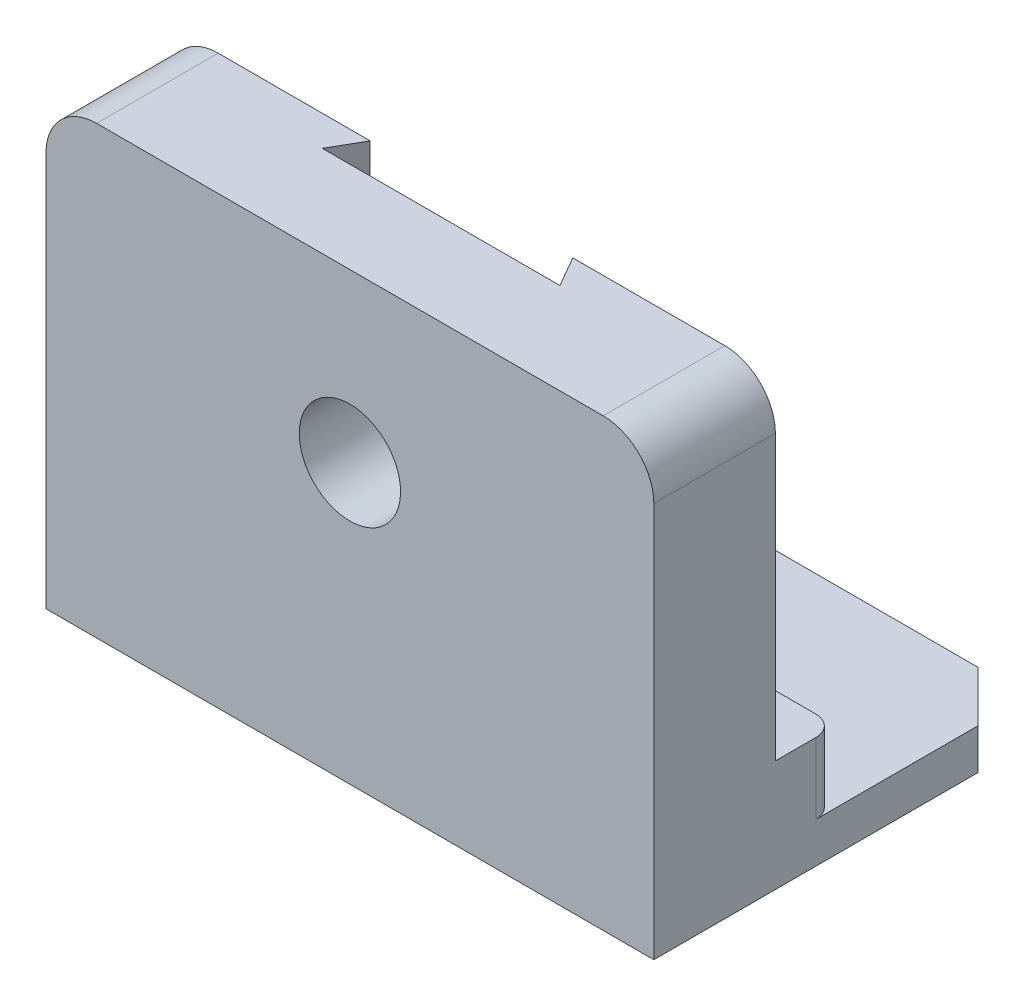
ISO-10303-21;
HEADER;
FILE_DESCRIPTION(('STEP AP214'),'2;1');
FILE_NAME('part.step','',(''),(''),'','','');
FILE_SCHEMA(('AUTOMOTIVE_DESIGN { 1 0 10303 214 1 1 1 1 }'));
ENDSEC;
DATA;
#1=APPLICATION_CONTEXT('core data for automotive mechanical design processes');
#2=APPLICATION_PROTOCOL_DEFINITION('international standard','automotive_design',2000,#1);
#3=PRODUCT_CONTEXT('',#1,'mechanical');
#4=PRODUCT('Part','Part','',(#3));
#5=PRODUCT_RELATED_PRODUCT_CATEGORY('part','',(#4));
#6=PRODUCT_DEFINITION_FORMATION('','',#4);
#7=PRODUCT_DEFINITION_CONTEXT('part definition',#1,'design');
#8=PRODUCT_DEFINITION('design','',#6,#7);
#9=PRODUCT_DEFINITION_SHAPE('','',#8);
#10=(LENGTH_UNIT() NAMED_UNIT(*) SI_UNIT(.MILLI.,.METRE.));
#11=(NAMED_UNIT(*) PLANE_ANGLE_UNIT() SI_UNIT($,.RADIAN.));
#12=(NAMED_UNIT(*) SI_UNIT($,.STERADIAN.) SOLID_ANGLE_UNIT());
#13=UNCERTAINTY_MEASURE_WITH_UNIT(LENGTH_MEASURE(1.E-05),#10,'distance_accuracy_value','');
#14=(GEOMETRIC_REPRESENTATION_CONTEXT(3) GLOBAL_UNCERTAINTY_ASSIGNED_CONTEXT((#13)) GLOBAL_UNIT_ASSIGNED_CONTEXT((#10,
#11,#12)) REPRESENTATION_CONTEXT('',''));
#15=CARTESIAN_POINT('',(0.,0.,0.));
#16=DIRECTION('',(0.,0.,1.));
#17=DIRECTION('',(1.,0.,0.));
#18=AXIS2_PLACEMENT_3D('',#15,#16,#17);
#19=CARTESIAN_POINT('',(30.,11.,-12.));
#20=DIRECTION('',(0.,-1.,0.));
#21=DIRECTION('',(0.,0.,-1.));
#22=AXIS2_PLACEMENT_3D('',#19,#20,#21);
#23=PLANE('',#22);
#24=DIRECTION('',(0.,0.,1.));
#25=VECTOR('',#24,1.);
#26=CARTESIAN_POINT('',(30.,11.,-12.));
#27=LINE('',#26,#25);
#28=CARTESIAN_POINT('',(30.,11.,-16.));
#29=VERTEX_POINT('',#28);
#30=CARTESIAN_POINT('',(30.,11.,-12.));
#31=VERTEX_POINT('',#30);
#32=EDGE_CURVE('E317',#29,#31,#27,.T.);
#33=ORIENTED_EDGE('',*,*,#32,.F.);
#34=CARTESIAN_POINT('',(28.,11.,-16.));
#35=DIRECTION('',(0.,-1.,0.));
#36=DIRECTION('',(0.,0.,-1.));
#37=AXIS2_PLACEMENT_3D('',#34,#35,#36);
#38=CIRCLE('',#37,2.);
#39=CARTESIAN_POINT('',(28.,11.,-18.));
#40=VERTEX_POINT('',#39);
#41=EDGE_CURVE('E437',#29,#40,#38,.F.);
#42=ORIENTED_EDGE('',*,*,#41,.T.);
#43=DIRECTION('',(1.,0.,0.));
#44=VECTOR('',#43,1.);
#45=CARTESIAN_POINT('',(4.,11.,-18.));
#46=LINE('',#45,#44);
#47=CARTESIAN_POINT('',(10.,11.,-18.));
#48=VERTEX_POINT('',#47);
#49=EDGE_CURVE('E291',#48,#40,#46,.T.);
#50=ORIENTED_EDGE('',*,*,#49,.F.);
#51=CARTESIAN_POINT('',(10.,11.,-24.));
#52=DIRECTION('',(0.,-1.,0.));
#53=DIRECTION('',(0.,0.,-1.));
#54=AXIS2_PLACEMENT_3D('',#51,#52,#53);
#55=CIRCLE('',#54,6.);
#56=CARTESIAN_POINT('',(4.,11.,-24.));
#57=VERTEX_POINT('',#56);
#58=EDGE_CURVE('E416',#48,#57,#55,.T.);
#59=ORIENTED_EDGE('',*,*,#58,.T.);
#60=DIRECTION('',(0.,0.,1.));
#61=VECTOR('',#60,1.);
#62=CARTESIAN_POINT('',(4.,11.,-37.));
#63=LINE('',#62,#61);
#64=CARTESIAN_POINT('',(4.,11.,-35.));
#65=VERTEX_POINT('',#64);
#66=EDGE_CURVE('E287',#65,#57,#63,.T.);
#67=ORIENTED_EDGE('',*,*,#66,.F.);
#68=CARTESIAN_POINT('',(2.,11.,-35.));
#69=DIRECTION('',(0.,-1.,0.));
#70=DIRECTION('',(0.,0.,-1.));
#71=AXIS2_PLACEMENT_3D('',#68,#69,#70);
#72=CIRCLE('',#71,2.);
#73=CARTESIAN_POINT('',(2.,11.,-37.));
#74=VERTEX_POINT('',#73);
#75=EDGE_CURVE('E434',#65,#74,#72,.F.);
#76=ORIENTED_EDGE('',*,*,#75,.T.);
#77=DIRECTION('',(-1.,0.,0.));
#78=VECTOR('',#77,1.);
#79=CARTESIAN_POINT('',(30.,11.,-37.));
#80=LINE('',#79,#78);
#81=CARTESIAN_POINT('',(-2.,11.,-37.));
#82=VERTEX_POINT('',#81);
#83=EDGE_CURVE('E347',#74,#82,#80,.T.);
#84=ORIENTED_EDGE('',*,*,#83,.T.);
#85=CARTESIAN_POINT('',(-2.,11.,-35.));
#86=DIRECTION('',(0.,-1.,0.));
#87=DIRECTION('',(0.,0.,-1.));
#88=AXIS2_PLACEMENT_3D('',#85,#86,#87);
#89=CIRCLE('',#88,2.);
#90=CARTESIAN_POINT('',(-4.,11.,-35.));
#91=VERTEX_POINT('',#90);
#92=EDGE_CURVE('E431',#82,#91,#89,.F.);
#93=ORIENTED_EDGE('',*,*,#92,.T.);
#94=DIRECTION('',(0.,0.,-1.));
#95=VECTOR('',#94,1.);
#96=CARTESIAN_POINT('',(-4.,11.,-37.));
#97=LINE('',#96,#95);
#98=CARTESIAN_POINT('',(-4.,11.,-24.));
#99=VERTEX_POINT('',#98);
#100=EDGE_CURVE('E272',#99,#91,#97,.T.);
#101=ORIENTED_EDGE('',*,*,#100,.F.);
#102=CARTESIAN_POINT('',(-10.,11.,-24.));
#103=DIRECTION('',(0.,-1.,0.));
#104=DIRECTION('',(0.,0.,-1.));
#105=AXIS2_PLACEMENT_3D('',#102,#103,#104);
#106=CIRCLE('',#105,6.);
#107=CARTESIAN_POINT('',(-10.,11.,-18.));
#108=VERTEX_POINT('',#107);
#109=EDGE_CURVE('E420',#99,#108,#106,.T.);
#110=ORIENTED_EDGE('',*,*,#109,.T.);
#111=DIRECTION('',(1.,0.,0.));
#112=VECTOR('',#111,1.);
#113=CARTESIAN_POINT('',(-4.,11.,-18.));
#114=LINE('',#113,#112);
#115=CARTESIAN_POINT('',(-28.,11.,-18.));
#116=VERTEX_POINT('',#115);
#117=EDGE_CURVE('E284',#116,#108,#114,.T.);
#118=ORIENTED_EDGE('',*,*,#117,.F.);
#119=CARTESIAN_POINT('',(-28.,11.,-16.));
#120=DIRECTION('',(0.,-1.,0.));
#121=DIRECTION('',(0.,0.,-1.));
#122=AXIS2_PLACEMENT_3D('',#119,#120,#121);
#123=CIRCLE('',#122,2.);
#124=CARTESIAN_POINT('',(-30.,11.,-16.));
#125=VERTEX_POINT('',#124);
#126=EDGE_CURVE('E428',#116,#125,#123,.F.);
#127=ORIENTED_EDGE('',*,*,#126,.T.);
#128=DIRECTION('',(0.,0.,1.));
#129=VECTOR('',#128,1.);
#130=CARTESIAN_POINT('',(-30.,11.,-12.));
#131=LINE('',#130,#129);
#132=CARTESIAN_POINT('',(-30.,11.,-12.));
#133=VERTEX_POINT('',#132);
#134=EDGE_CURVE('E331',#125,#133,#131,.T.);
#135=ORIENTED_EDGE('',*,*,#134,.T.);
#136=DIRECTION('',(-1.,0.,0.));
#137=VECTOR('',#136,1.);
#138=CARTESIAN_POINT('',(30.,11.,-12.));
#139=LINE('',#138,#137);
#140=EDGE_CURVE('E343',#31,#133,#139,.T.);
#141=ORIENTED_EDGE('',*,*,#140,.F.);
#142=EDGE_LOOP('',(#33,#42,#50,#59,#67,#76,#84,#93,#101,#110,#118,#127,#135,#141));
#143=FACE_BOUND('',#142,.T.);
#144=CARTESIAN_POINT('',(0.,11.,-31.));
#145=DIRECTION('',(0.,1.,0.));
#146=DIRECTION('',(0.,0.,1.));
#147=AXIS2_PLACEMENT_3D('',#144,#145,#146);
#148=CIRCLE('',#147,2.);
#149=CARTESIAN_POINT('',(0.,11.,-29.));
#150=VERTEX_POINT('',#149);
#151=EDGE_CURVE('E644',#150,#150,#148,.T.);
#152=ORIENTED_EDGE('',*,*,#151,.F.);
#153=EDGE_LOOP('',(#152));
#154=FACE_BOUND('',#153,.T.);
#155=CARTESIAN_POINT('',(24.,11.,-15.));
#156=DIRECTION('',(0.,1.,0.));
#157=DIRECTION('',(0.,0.,1.));
#158=AXIS2_PLACEMENT_3D('',#155,#156,#157);
#159=CIRCLE('',#158,2.);
#160=CARTESIAN_POINT('',(24.,11.,-13.));
#161=VERTEX_POINT('',#160);
#162=EDGE_CURVE('E634',#161,#161,#159,.T.);
#163=ORIENTED_EDGE('',*,*,#162,.F.);
#164=EDGE_LOOP('',(#163));
#165=FACE_BOUND('',#164,.T.);
#166=CARTESIAN_POINT('',(-24.,11.,-15.));
#167=DIRECTION('',(0.,1.,0.));
#168=DIRECTION('',(0.,0.,1.));
#169=AXIS2_PLACEMENT_3D('',#166,#167,#168);
#170=CIRCLE('',#169,2.);
#171=CARTESIAN_POINT('',(-24.,11.,-13.));
#172=VERTEX_POINT('',#171);
#173=EDGE_CURVE('E629',#172,#172,#170,.T.);
#174=ORIENTED_EDGE('',*,*,#173,.F.);
#175=EDGE_LOOP('',(#174));
#176=FACE_BOUND('',#175,.T.);
#177=ADVANCED_FACE('F45',(#143,#154,#165,#176),#23,.F.);
#178=CARTESIAN_POINT('',(30.,0.,0.));
#179=DIRECTION('',(0.,0.,-1.));
#180=DIRECTION('',(-1.,0.,0.));
#181=AXIS2_PLACEMENT_3D('',#178,#179,#180);
#182=PLANE('',#181);
#183=CARTESIAN_POINT('',(7.04753548759224E-06,27.5,0.));
#184=DIRECTION('',(0.,0.,-1.));
#185=DIRECTION('',(-1.,0.,0.));
#186=AXIS2_PLACEMENT_3D('',#183,#184,#185);
#187=CIRCLE('',#186,4.99999999999999);
#188=CARTESIAN_POINT('',(-4.99999295246451,27.5,0.));
#189=VERTEX_POINT('',#188);
#190=EDGE_CURVE('E246',#189,#189,#187,.T.);
#191=ORIENTED_EDGE('',*,*,#190,.T.);
#192=EDGE_LOOP('',(#191));
#193=FACE_BOUND('',#192,.T.);
#194=DIRECTION('',(-1.,0.,0.));
#195=VECTOR('',#194,1.);
#196=CARTESIAN_POINT('',(30.,44.,0.));
#197=LINE('',#196,#195);
#198=CARTESIAN_POINT('',(25.,44.,0.));
#199=VERTEX_POINT('',#198);
#200=CARTESIAN_POINT('',(-25.,44.,0.));
#201=VERTEX_POINT('',#200);
#202=EDGE_CURVE('E324',#199,#201,#197,.T.);
#203=ORIENTED_EDGE('',*,*,#202,.T.);
#204=CARTESIAN_POINT('',(-25.,39.,0.));
#205=DIRECTION('',(0.,0.,-1.));
#206=DIRECTION('',(-1.,0.,0.));
#207=AXIS2_PLACEMENT_3D('',#204,#205,#206);
#208=CIRCLE('',#207,5.);
#209=CARTESIAN_POINT('',(-30.,39.,0.));
#210=VERTEX_POINT('',#209);
#211=EDGE_CURVE('E378',#201,#210,#208,.F.);
#212=ORIENTED_EDGE('',*,*,#211,.T.);
#213=DIRECTION('',(0.,-1.,0.));
#214=VECTOR('',#213,1.);
#215=CARTESIAN_POINT('',(-30.,0.,0.));
#216=LINE('',#215,#214);
#217=CARTESIAN_POINT('',(-30.,0.,0.));
#218=VERTEX_POINT('',#217);
#219=EDGE_CURVE('E283',#210,#218,#216,.T.);
#220=ORIENTED_EDGE('',*,*,#219,.T.);
#221=DIRECTION('',(-1.,0.,0.));
#222=VECTOR('',#221,1.);
#223=CARTESIAN_POINT('',(30.,0.,0.));
#224=LINE('',#223,#222);
#225=CARTESIAN_POINT('',(30.,0.,0.));
#226=VERTEX_POINT('',#225);
#227=EDGE_CURVE('E355',#226,#218,#224,.T.);
#228=ORIENTED_EDGE('',*,*,#227,.F.);
#229=DIRECTION('',(0.,-1.,0.));
#230=VECTOR('',#229,1.);
#231=CARTESIAN_POINT('',(30.,0.,0.));
#232=LINE('',#231,#230);
#233=CARTESIAN_POINT('',(30.,39.,0.));
#234=VERTEX_POINT('',#233);
#235=EDGE_CURVE('E310',#234,#226,#232,.T.);
#236=ORIENTED_EDGE('',*,*,#235,.F.);
#237=CARTESIAN_POINT('',(25.,39.,0.));
#238=DIRECTION('',(0.,0.,-1.));
#239=DIRECTION('',(-1.,0.,0.));
#240=AXIS2_PLACEMENT_3D('',#237,#238,#239);
#241=CIRCLE('',#240,5.);
#242=EDGE_CURVE('E375',#234,#199,#241,.F.);
#243=ORIENTED_EDGE('',*,*,#242,.T.);
#244=EDGE_LOOP('',(#203,#212,#220,#228,#236,#243));
#245=FACE_BOUND('',#244,.T.);
#246=ADVANCED_FACE('F525',(#193,#245),#182,.F.);
#247=CARTESIAN_POINT('',(30.,0.,-37.));
#248=DIRECTION('',(0.,1.,0.));
#249=DIRECTION('',(0.,0.,1.));
#250=AXIS2_PLACEMENT_3D('',#247,#248,#249);
#251=PLANE('',#250);
#252=CARTESIAN_POINT('',(-24.,0.,-15.));
#253=DIRECTION('',(0.,1.,0.));
#254=DIRECTION('',(0.,0.,1.));
#255=AXIS2_PLACEMENT_3D('',#252,#253,#254);
#256=CIRCLE('',#255,2.);
#257=CARTESIAN_POINT('',(-24.,0.,-13.));
#258=VERTEX_POINT('',#257);
#259=EDGE_CURVE('E626',#258,#258,#256,.T.);
#260=ORIENTED_EDGE('',*,*,#259,.T.);
#261=EDGE_LOOP('',(#260));
#262=FACE_BOUND('',#261,.T.);
#263=CARTESIAN_POINT('',(24.,0.,-15.));
#264=DIRECTION('',(0.,1.,0.));
#265=DIRECTION('',(0.,0.,1.));
#266=AXIS2_PLACEMENT_3D('',#263,#264,#265);
#267=CIRCLE('',#266,2.);
#268=CARTESIAN_POINT('',(24.,0.,-13.));
#269=VERTEX_POINT('',#268);
#270=EDGE_CURVE('E640',#269,#269,#267,.T.);
#271=ORIENTED_EDGE('',*,*,#270,.T.);
#272=EDGE_LOOP('',(#271));
#273=FACE_BOUND('',#272,.T.);
#274=CARTESIAN_POINT('',(0.,0.,-31.));
#275=DIRECTION('',(0.,1.,0.));
#276=DIRECTION('',(0.,0.,1.));
#277=AXIS2_PLACEMENT_3D('',#274,#275,#276);
#278=CIRCLE('',#277,2.);
#279=CARTESIAN_POINT('',(0.,0.,-29.));
#280=VERTEX_POINT('',#279);
#281=EDGE_CURVE('E648',#280,#280,#278,.T.);
#282=ORIENTED_EDGE('',*,*,#281,.T.);
#283=EDGE_LOOP('',(#282));
#284=FACE_BOUND('',#283,.T.);
#285=DIRECTION('',(0.,0.,-1.));
#286=VECTOR('',#285,1.);
#287=CARTESIAN_POINT('',(-30.,0.,-37.));
#288=LINE('',#287,#286);
#289=CARTESIAN_POINT('',(-30.,0.,-32.));
#290=VERTEX_POINT('',#289);
#291=EDGE_CURVE('E327',#218,#290,#288,.T.);
#292=ORIENTED_EDGE('',*,*,#291,.T.);
#293=DIRECTION('',(0.707106781186546,0.,-0.707106781186549));
#294=VECTOR('',#293,1.);
#295=CARTESIAN_POINT('',(-25.,0.,-37.));
#296=LINE('',#295,#294);
#297=CARTESIAN_POINT('',(-25.,0.,-37.));
#298=VERTEX_POINT('',#297);
#299=EDGE_CURVE('E495',#290,#298,#296,.T.);
#300=ORIENTED_EDGE('',*,*,#299,.T.);
#301=DIRECTION('',(-1.,0.,0.));
#302=VECTOR('',#301,1.);
#303=CARTESIAN_POINT('',(30.,0.,-37.));
#304=LINE('',#303,#302);
#305=CARTESIAN_POINT('',(25.,0.,-37.));
#306=VERTEX_POINT('',#305);
#307=EDGE_CURVE('E351',#306,#298,#304,.T.);
#308=ORIENTED_EDGE('',*,*,#307,.F.);
#309=DIRECTION('',(-0.70710678118655,0.,-0.707106781186546));
#310=VECTOR('',#309,1.);
#311=CARTESIAN_POINT('',(30.,0.,-32.));
#312=LINE('',#311,#310);
#313=CARTESIAN_POINT('',(30.,0.,-32.));
#314=VERTEX_POINT('',#313);
#315=EDGE_CURVE('E68',#306,#314,#312,.F.);
#316=ORIENTED_EDGE('',*,*,#315,.T.);
#317=DIRECTION('',(0.,0.,-1.));
#318=VECTOR('',#317,1.);
#319=CARTESIAN_POINT('',(30.,0.,-37.));
#320=LINE('',#319,#318);
#321=EDGE_CURVE('E313',#226,#314,#320,.T.);
#322=ORIENTED_EDGE('',*,*,#321,.F.);
#323=ORIENTED_EDGE('',*,*,#227,.T.);
#324=EDGE_LOOP('',(#292,#300,#308,#316,#322,#323));
#325=FACE_BOUND('',#324,.T.);
#326=ADVANCED_FACE('F543',(#262,#273,#284,#325),#251,.F.);
#327=CARTESIAN_POINT('',(30.,11.,-37.));
#328=DIRECTION('',(0.,0.,1.));
#329=DIRECTION('',(1.,0.,0.));
#330=AXIS2_PLACEMENT_3D('',#327,#328,#329);
#331=PLANE('',#330);
#332=ORIENTED_EDGE('',*,*,#307,.T.);
#333=DIRECTION('',(0.,1.,0.));
#334=VECTOR('',#333,1.);
#335=CARTESIAN_POINT('',(-25.,3.99999999999999,-37.));
#336=LINE('',#335,#334);
#337=CARTESIAN_POINT('',(-25.,3.99999999999999,-37.));
#338=VERTEX_POINT('',#337);
#339=EDGE_CURVE('E483',#298,#338,#336,.T.);
#340=ORIENTED_EDGE('',*,*,#339,.T.);
#341=DIRECTION('',(-1.,0.,0.));
#342=VECTOR('',#341,1.);
#343=CARTESIAN_POINT('',(-30.,3.99999999999999,-37.));
#344=LINE('',#343,#342);
#345=CARTESIAN_POINT('',(-2.,3.99999999999999,-37.));
#346=VERTEX_POINT('',#345);
#347=EDGE_CURVE('E279',#346,#338,#344,.T.);
#348=ORIENTED_EDGE('',*,*,#347,.F.);
#349=DIRECTION('',(0.,1.,0.));
#350=VECTOR('',#349,1.);
#351=CARTESIAN_POINT('',(-2.,11.,-37.));
#352=LINE('',#351,#350);
#353=EDGE_CURVE('E447',#346,#82,#352,.T.);
#354=ORIENTED_EDGE('',*,*,#353,.T.);
#355=ORIENTED_EDGE('',*,*,#83,.F.);
#356=DIRECTION('',(0.,1.,0.));
#357=VECTOR('',#356,1.);
#358=CARTESIAN_POINT('',(2.,11.,-37.));
#359=LINE('',#358,#357);
#360=CARTESIAN_POINT('',(2.,3.99999999999999,-37.));
#361=VERTEX_POINT('',#360);
#362=EDGE_CURVE('E451',#74,#361,#359,.F.);
#363=ORIENTED_EDGE('',*,*,#362,.T.);
#364=DIRECTION('',(-1.,0.,0.));
#365=VECTOR('',#364,1.);
#366=CARTESIAN_POINT('',(30.,3.99999999999999,-37.));
#367=LINE('',#366,#365);
#368=CARTESIAN_POINT('',(25.,3.99999999999999,-37.));
#369=VERTEX_POINT('',#368);
#370=EDGE_CURVE('E295',#369,#361,#367,.T.);
#371=ORIENTED_EDGE('',*,*,#370,.F.);
#372=DIRECTION('',(0.,-1.,0.));
#373=VECTOR('',#372,1.);
#374=CARTESIAN_POINT('',(25.,11.,-37.));
#375=LINE('',#374,#373);
#376=EDGE_CURVE('E480',#369,#306,#375,.T.);
#377=ORIENTED_EDGE('',*,*,#376,.T.);
#378=EDGE_LOOP('',(#332,#340,#348,#354,#355,#363,#371,#377));
#379=FACE_BOUND('',#378,.T.);
#380=ADVANCED_FACE('F545',(#379),#331,.F.);
#381=CARTESIAN_POINT('',(30.,44.,-12.));
#382=DIRECTION('',(0.,0.,1.));
#383=DIRECTION('',(0.,-1.,0.));
#384=AXIS2_PLACEMENT_3D('',#381,#382,#383);
#385=PLANE('',#384);
#386=DIRECTION('',(0.,1.,0.));
#387=VECTOR('',#386,1.);
#388=CARTESIAN_POINT('',(-30.,44.,-12.));
#389=LINE('',#388,#387);
#390=CARTESIAN_POINT('',(-30.,39.,-12.));
#391=VERTEX_POINT('',#390);
#392=EDGE_CURVE('E314',#133,#391,#389,.T.);
#393=ORIENTED_EDGE('',*,*,#392,.T.);
#394=CARTESIAN_POINT('',(-25.,39.,-12.));
#395=DIRECTION('',(0.,0.,1.));
#396=DIRECTION('',(0.,-1.,0.));
#397=AXIS2_PLACEMENT_3D('',#394,#395,#396);
#398=CIRCLE('',#397,5.);
#399=CARTESIAN_POINT('',(-25.,44.,-12.));
#400=VERTEX_POINT('',#399);
#401=EDGE_CURVE('E387',#391,#400,#398,.F.);
#402=ORIENTED_EDGE('',*,*,#401,.T.);
#403=DIRECTION('',(-1.,0.,0.));
#404=VECTOR('',#403,1.);
#405=CARTESIAN_POINT('',(30.,44.,-12.));
#406=LINE('',#405,#404);
#407=CARTESIAN_POINT('',(-9.99998872394556,44.,-12.));
#408=VERTEX_POINT('',#407);
#409=EDGE_CURVE('E339',#408,#400,#406,.T.);
#410=ORIENTED_EDGE('',*,*,#409,.F.);
#411=DIRECTION('',(-6.8339738079947E-07,-0.999999999999767,0.));
#412=VECTOR('',#411,1.);
#413=CARTESIAN_POINT('',(-9.99998872394556,44.,-12.));
#414=LINE('',#413,#412);
#415=CARTESIAN_POINT('',(-9.99999999999767,27.5000068339738,-12.));
#416=VERTEX_POINT('',#415);
#417=EDGE_CURVE('E251',#408,#416,#414,.T.);
#418=ORIENTED_EDGE('',*,*,#417,.T.);
#419=CARTESIAN_POINT('',(0.,27.5,-12.));
#420=DIRECTION('',(0.,0.,-1.));
#421=DIRECTION('',(0.,1.,0.));
#422=AXIS2_PLACEMENT_3D('',#419,#420,#421);
#423=CIRCLE('',#422,10.);
#424=CARTESIAN_POINT('',(9.99999999999767,27.4999931660262,-12.));
#425=VERTEX_POINT('',#424);
#426=EDGE_CURVE('E227',#425,#416,#423,.T.);
#427=ORIENTED_EDGE('',*,*,#426,.F.);
#428=DIRECTION('',(-6.83397380535357E-07,-0.999999999999766,0.));
#429=VECTOR('',#428,1.);
#430=CARTESIAN_POINT('',(10.0000112760591,44.,-12.));
#431=LINE('',#430,#429);
#432=CARTESIAN_POINT('',(10.0000112760591,44.,-12.));
#433=VERTEX_POINT('',#432);
#434=EDGE_CURVE('E239',#433,#425,#431,.T.);
#435=ORIENTED_EDGE('',*,*,#434,.F.);
#436=CARTESIAN_POINT('',(25.,44.,-12.));
#437=VERTEX_POINT('',#436);
#438=EDGE_CURVE('E340',#437,#433,#406,.T.);
#439=ORIENTED_EDGE('',*,*,#438,.F.);
#440=CARTESIAN_POINT('',(25.,39.,-12.));
#441=DIRECTION('',(0.,0.,1.));
#442=DIRECTION('',(0.,-1.,0.));
#443=AXIS2_PLACEMENT_3D('',#440,#441,#442);
#444=CIRCLE('',#443,5.);
#445=CARTESIAN_POINT('',(30.,39.,-12.));
#446=VERTEX_POINT('',#445);
#447=EDGE_CURVE('E384',#437,#446,#444,.F.);
#448=ORIENTED_EDGE('',*,*,#447,.T.);
#449=DIRECTION('',(0.,1.,0.));
#450=VECTOR('',#449,1.);
#451=CARTESIAN_POINT('',(30.,44.,-12.));
#452=LINE('',#451,#450);
#453=EDGE_CURVE('E320',#31,#446,#452,.T.);
#454=ORIENTED_EDGE('',*,*,#453,.F.);
#455=ORIENTED_EDGE('',*,*,#140,.T.);
#456=EDGE_LOOP('',(#393,#402,#410,#418,#427,#435,#439,#448,#454,#455));
#457=FACE_BOUND('',#456,.T.);
#458=ADVANCED_FACE('F249',(#457),#385,.F.);
#459=CARTESIAN_POINT('',(30.,44.,0.));
#460=DIRECTION('',(0.,-1.,0.));
#461=DIRECTION('',(0.,0.,-1.));
#462=AXIS2_PLACEMENT_3D('',#459,#460,#461);
#463=PLANE('',#462);
#464=ORIENTED_EDGE('',*,*,#409,.T.);
#465=DIRECTION('',(0.,0.,1.));
#466=VECTOR('',#465,1.);
#467=CARTESIAN_POINT('',(-25.,44.,0.));
#468=LINE('',#467,#466);
#469=EDGE_CURVE('E371',#400,#201,#468,.T.);
#470=ORIENTED_EDGE('',*,*,#469,.T.);
#471=ORIENTED_EDGE('',*,*,#202,.F.);
#472=DIRECTION('',(0.,0.,1.));
#473=VECTOR('',#472,1.);
#474=CARTESIAN_POINT('',(25.,44.,0.));
#475=LINE('',#474,#473);
#476=EDGE_CURVE('E368',#199,#437,#475,.F.);
#477=ORIENTED_EDGE('',*,*,#476,.T.);
#478=ORIENTED_EDGE('',*,*,#438,.T.);
#479=DIRECTION('',(0.500000000000089,0.,0.866025403784388));
#480=VECTOR('',#479,1.);
#481=CARTESIAN_POINT('',(20.1961608797534,44.,5.66024915516752));
#482=LINE('',#481,#480);
#483=CARTESIAN_POINT('',(11.7320620836284,44.,-8.99999999999999));
#484=VERTEX_POINT('',#483);
#485=EDGE_CURVE('E242',#433,#484,#482,.T.);
#486=ORIENTED_EDGE('',*,*,#485,.T.);
#487=DIRECTION('',(1.,0.,0.));
#488=VECTOR('',#487,1.);
#489=CARTESIAN_POINT('',(30.,44.,-8.99999999999999));
#490=LINE('',#489,#488);
#491=CARTESIAN_POINT('',(-11.7320395315148,44.,-8.99999999999999));
#492=VERTEX_POINT('',#491);
#493=EDGE_CURVE('E359',#492,#484,#490,.T.);
#494=ORIENTED_EDGE('',*,*,#493,.F.);
#495=DIRECTION('',(0.500000000000089,0.,-0.866025403784388));
#496=VECTOR('',#495,1.);
#497=CARTESIAN_POINT('',(-5.19614396566286,44.,-20.3205031930171));
#498=LINE('',#497,#496);
#499=EDGE_CURVE('E362',#408,#492,#498,.F.);
#500=ORIENTED_EDGE('',*,*,#499,.F.);
#501=EDGE_LOOP('',(#464,#470,#471,#477,#478,#486,#494,#500));
#502=FACE_BOUND('',#501,.T.);
#503=ADVANCED_FACE('F529',(#502),#463,.F.);
#504=CARTESIAN_POINT('',(30.,0.,0.));
#505=DIRECTION('',(-1.,0.,0.));
#506=DIRECTION('',(0.,0.,1.));
#507=AXIS2_PLACEMENT_3D('',#504,#505,#506);
#508=PLANE('',#507);
#509=ORIENTED_EDGE('',*,*,#321,.T.);
#510=DIRECTION('',(0.,1.,0.));
#511=VECTOR('',#510,1.);
#512=CARTESIAN_POINT('',(30.,0.,-32.));
#513=LINE('',#512,#511);
#514=CARTESIAN_POINT('',(30.,3.99999999999999,-32.));
#515=VERTEX_POINT('',#514);
#516=EDGE_CURVE('E55',#314,#515,#513,.T.);
#517=ORIENTED_EDGE('',*,*,#516,.T.);
#518=DIRECTION('',(0.,0.,-1.));
#519=VECTOR('',#518,1.);
#520=CARTESIAN_POINT('',(30.,3.99999999999999,-18.));
#521=LINE('',#520,#519);
#522=CARTESIAN_POINT('',(30.,3.99999999999999,-16.));
#523=VERTEX_POINT('',#522);
#524=EDGE_CURVE('E267',#523,#515,#521,.T.);
#525=ORIENTED_EDGE('',*,*,#524,.F.);
#526=DIRECTION('',(0.,1.,0.));
#527=VECTOR('',#526,1.);
#528=CARTESIAN_POINT('',(30.,0.,-16.));
#529=LINE('',#528,#527);
#530=EDGE_CURVE('E424',#523,#29,#529,.T.);
#531=ORIENTED_EDGE('',*,*,#530,.T.);
#532=ORIENTED_EDGE('',*,*,#32,.T.);
#533=ORIENTED_EDGE('',*,*,#453,.T.);
#534=DIRECTION('',(0.,0.,1.));
#535=VECTOR('',#534,1.);
#536=CARTESIAN_POINT('',(30.,39.,0.));
#537=LINE('',#536,#535);
#538=EDGE_CURVE('E390',#446,#234,#537,.T.);
#539=ORIENTED_EDGE('',*,*,#538,.T.);
#540=ORIENTED_EDGE('',*,*,#235,.T.);
#541=EDGE_LOOP('',(#509,#517,#525,#531,#532,#533,#539,#540));
#542=FACE_BOUND('',#541,.T.);
#543=ADVANCED_FACE('F499',(#542),#508,.F.);
#544=CARTESIAN_POINT('',(-30.,0.,0.));
#545=DIRECTION('',(-1.,0.,0.));
#546=DIRECTION('',(0.,0.,1.));
#547=AXIS2_PLACEMENT_3D('',#544,#545,#546);
#548=PLANE('',#547);
#549=DIRECTION('',(0.,0.,1.));
#550=VECTOR('',#549,1.);
#551=CARTESIAN_POINT('',(-30.,3.99999999999999,-18.));
#552=LINE('',#551,#550);
#553=CARTESIAN_POINT('',(-30.,3.99999999999999,-32.));
#554=VERTEX_POINT('',#553);
#555=CARTESIAN_POINT('',(-30.,3.99999999999999,-16.));
#556=VERTEX_POINT('',#555);
#557=EDGE_CURVE('E268',#554,#556,#552,.T.);
#558=ORIENTED_EDGE('',*,*,#557,.F.);
#559=DIRECTION('',(0.,-1.,0.));
#560=VECTOR('',#559,1.);
#561=CARTESIAN_POINT('',(-30.,0.,-32.));
#562=LINE('',#561,#560);
#563=EDGE_CURVE('E490',#554,#290,#562,.T.);
#564=ORIENTED_EDGE('',*,*,#563,.T.);
#565=ORIENTED_EDGE('',*,*,#291,.F.);
#566=ORIENTED_EDGE('',*,*,#219,.F.);
#567=DIRECTION('',(0.,0.,1.));
#568=VECTOR('',#567,1.);
#569=CARTESIAN_POINT('',(-30.,39.,-12.));
#570=LINE('',#569,#568);
#571=EDGE_CURVE('E381',#210,#391,#570,.F.);
#572=ORIENTED_EDGE('',*,*,#571,.T.);
#573=ORIENTED_EDGE('',*,*,#392,.F.);
#574=ORIENTED_EDGE('',*,*,#134,.F.);
#575=DIRECTION('',(0.,1.,0.));
#576=VECTOR('',#575,1.);
#577=CARTESIAN_POINT('',(-30.,3.99999999999999,-16.));
#578=LINE('',#577,#576);
#579=EDGE_CURVE('E462',#125,#556,#578,.F.);
#580=ORIENTED_EDGE('',*,*,#579,.T.);
#581=EDGE_LOOP('',(#558,#564,#565,#566,#572,#573,#574,#580));
#582=FACE_BOUND('',#581,.T.);
#583=ADVANCED_FACE('F540',(#582),#548,.T.);
#584=CARTESIAN_POINT('',(-4.,3.99999999999999,-37.));
#585=DIRECTION('',(1.,0.,0.));
#586=DIRECTION('',(0.,0.,-1.));
#587=AXIS2_PLACEMENT_3D('',#584,#585,#586);
#588=PLANE('',#587);
#589=ORIENTED_EDGE('',*,*,#100,.T.);
#590=DIRECTION('',(0.,1.,0.));
#591=VECTOR('',#590,1.);
#592=CARTESIAN_POINT('',(-4.,3.99999999999999,-35.));
#593=LINE('',#592,#591);
#594=CARTESIAN_POINT('',(-4.,3.99999999999999,-35.));
#595=VERTEX_POINT('',#594);
#596=EDGE_CURVE('E455',#91,#595,#593,.F.);
#597=ORIENTED_EDGE('',*,*,#596,.T.);
#598=DIRECTION('',(0.,0.,-1.));
#599=VECTOR('',#598,1.);
#600=CARTESIAN_POINT('',(-4.,3.99999999999999,-37.));
#601=LINE('',#600,#599);
#602=CARTESIAN_POINT('',(-4.,3.99999999999999,-24.));
#603=VERTEX_POINT('',#602);
#604=EDGE_CURVE('E275',#603,#595,#601,.T.);
#605=ORIENTED_EDGE('',*,*,#604,.F.);
#606=DIRECTION('',(0.,1.,0.));
#607=VECTOR('',#606,1.);
#608=CARTESIAN_POINT('',(-4.,11.,-24.));
#609=LINE('',#608,#607);
#610=EDGE_CURVE('E405',#603,#99,#609,.T.);
#611=ORIENTED_EDGE('',*,*,#610,.T.);
#612=EDGE_LOOP('',(#589,#597,#605,#611));
#613=FACE_BOUND('',#612,.T.);
#614=ADVANCED_FACE('F569',(#613),#588,.F.);
#615=CARTESIAN_POINT('',(-4.,3.99999999999999,-18.));
#616=DIRECTION('',(0.,0.,1.));
#617=DIRECTION('',(1.,0.,0.));
#618=AXIS2_PLACEMENT_3D('',#615,#616,#617);
#619=PLANE('',#618);
#620=DIRECTION('',(1.,0.,0.));
#621=VECTOR('',#620,1.);
#622=CARTESIAN_POINT('',(-4.,3.99999999999999,-18.));
#623=LINE('',#622,#621);
#624=CARTESIAN_POINT('',(-28.,3.99999999999999,-18.));
#625=VERTEX_POINT('',#624);
#626=CARTESIAN_POINT('',(-10.,3.99999999999999,-18.));
#627=VERTEX_POINT('',#626);
#628=EDGE_CURVE('E271',#625,#627,#623,.T.);
#629=ORIENTED_EDGE('',*,*,#628,.F.);
#630=DIRECTION('',(0.,1.,0.));
#631=VECTOR('',#630,1.);
#632=CARTESIAN_POINT('',(-28.,11.,-18.));
#633=LINE('',#632,#631);
#634=EDGE_CURVE('E458',#625,#116,#633,.T.);
#635=ORIENTED_EDGE('',*,*,#634,.T.);
#636=ORIENTED_EDGE('',*,*,#117,.T.);
#637=DIRECTION('',(0.,1.,0.));
#638=VECTOR('',#637,1.);
#639=CARTESIAN_POINT('',(-10.,3.99999999999999,-18.));
#640=LINE('',#639,#638);
#641=EDGE_CURVE('E409',#108,#627,#640,.F.);
#642=ORIENTED_EDGE('',*,*,#641,.T.);
#643=EDGE_LOOP('',(#629,#635,#636,#642));
#644=FACE_BOUND('',#643,.T.);
#645=ADVANCED_FACE('F583',(#644),#619,.F.);
#646=CARTESIAN_POINT('',(0.,3.99999999999999,0.));
#647=DIRECTION('',(0.,-1.,0.));
#648=DIRECTION('',(0.,0.,-1.));
#649=AXIS2_PLACEMENT_3D('',#646,#647,#648);
#650=PLANE('',#649);
#651=ORIENTED_EDGE('',*,*,#347,.T.);
#652=DIRECTION('',(-0.707106781186546,0.,0.707106781186549));
#653=VECTOR('',#652,1.);
#654=CARTESIAN_POINT('',(-25.,3.99999999999999,-37.));
#655=LINE('',#654,#653);
#656=EDGE_CURVE('E487',#338,#554,#655,.T.);
#657=ORIENTED_EDGE('',*,*,#656,.T.);
#658=ORIENTED_EDGE('',*,*,#557,.T.);
#659=CARTESIAN_POINT('',(-28.,3.99999999999999,-16.));
#660=DIRECTION('',(0.,-1.,0.));
#661=DIRECTION('',(0.,0.,-1.));
#662=AXIS2_PLACEMENT_3D('',#659,#660,#661);
#663=CIRCLE('',#662,2.);
#664=EDGE_CURVE('E477',#556,#625,#663,.T.);
#665=ORIENTED_EDGE('',*,*,#664,.T.);
#666=ORIENTED_EDGE('',*,*,#628,.T.);
#667=CARTESIAN_POINT('',(-10.,3.99999999999999,-24.));
#668=DIRECTION('',(0.,-1.,0.));
#669=DIRECTION('',(0.,0.,-1.));
#670=AXIS2_PLACEMENT_3D('',#667,#668,#669);
#671=CIRCLE('',#670,6.);
#672=EDGE_CURVE('E413',#627,#603,#671,.F.);
#673=ORIENTED_EDGE('',*,*,#672,.T.);
#674=ORIENTED_EDGE('',*,*,#604,.T.);
#675=CARTESIAN_POINT('',(-2.,3.99999999999999,-35.));
#676=DIRECTION('',(0.,-1.,0.));
#677=DIRECTION('',(0.,0.,-1.));
#678=AXIS2_PLACEMENT_3D('',#675,#676,#677);
#679=CIRCLE('',#678,2.);
#680=EDGE_CURVE('E473',#595,#346,#679,.T.);
#681=ORIENTED_EDGE('',*,*,#680,.T.);
#682=EDGE_LOOP('',(#651,#657,#658,#665,#666,#673,#674,#681));
#683=FACE_BOUND('',#682,.T.);
#684=ADVANCED_FACE('F578',(#683),#650,.F.);
#685=CARTESIAN_POINT('',(4.,3.99999999999999,-18.));
#686=DIRECTION('',(0.,0.,1.));
#687=DIRECTION('',(1.,0.,0.));
#688=AXIS2_PLACEMENT_3D('',#685,#686,#687);
#689=PLANE('',#688);
#690=ORIENTED_EDGE('',*,*,#49,.T.);
#691=DIRECTION('',(0.,1.,0.));
#692=VECTOR('',#691,1.);
#693=CARTESIAN_POINT('',(28.,3.99999999999999,-18.));
#694=LINE('',#693,#692);
#695=CARTESIAN_POINT('',(28.,3.99999999999999,-18.));
#696=VERTEX_POINT('',#695);
#697=EDGE_CURVE('E440',#40,#696,#694,.F.);
#698=ORIENTED_EDGE('',*,*,#697,.T.);
#699=DIRECTION('',(1.,0.,0.));
#700=VECTOR('',#699,1.);
#701=CARTESIAN_POINT('',(4.,3.99999999999999,-18.));
#702=LINE('',#701,#700);
#703=CARTESIAN_POINT('',(10.,3.99999999999999,-18.));
#704=VERTEX_POINT('',#703);
#705=EDGE_CURVE('E301',#704,#696,#702,.T.);
#706=ORIENTED_EDGE('',*,*,#705,.F.);
#707=DIRECTION('',(0.,1.,0.));
#708=VECTOR('',#707,1.);
#709=CARTESIAN_POINT('',(10.,11.,-18.));
#710=LINE('',#709,#708);
#711=EDGE_CURVE('E394',#704,#48,#710,.T.);
#712=ORIENTED_EDGE('',*,*,#711,.T.);
#713=EDGE_LOOP('',(#690,#698,#706,#712));
#714=FACE_BOUND('',#713,.T.);
#715=ADVANCED_FACE('F575',(#714),#689,.F.);
#716=CARTESIAN_POINT('',(4.,3.99999999999999,-37.));
#717=DIRECTION('',(-1.,0.,0.));
#718=DIRECTION('',(0.,0.,1.));
#719=AXIS2_PLACEMENT_3D('',#716,#717,#718);
#720=PLANE('',#719);
#721=DIRECTION('',(0.,0.,1.));
#722=VECTOR('',#721,1.);
#723=CARTESIAN_POINT('',(4.,3.99999999999999,-37.));
#724=LINE('',#723,#722);
#725=CARTESIAN_POINT('',(4.,3.99999999999999,-35.));
#726=VERTEX_POINT('',#725);
#727=CARTESIAN_POINT('',(4.,3.99999999999999,-24.));
#728=VERTEX_POINT('',#727);
#729=EDGE_CURVE('E305',#726,#728,#724,.T.);
#730=ORIENTED_EDGE('',*,*,#729,.F.);
#731=DIRECTION('',(0.,1.,0.));
#732=VECTOR('',#731,1.);
#733=CARTESIAN_POINT('',(4.,3.99999999999999,-35.));
#734=LINE('',#733,#732);
#735=EDGE_CURVE('E443',#726,#65,#734,.T.);
#736=ORIENTED_EDGE('',*,*,#735,.T.);
#737=ORIENTED_EDGE('',*,*,#66,.T.);
#738=DIRECTION('',(0.,1.,0.));
#739=VECTOR('',#738,1.);
#740=CARTESIAN_POINT('',(4.,3.99999999999999,-24.));
#741=LINE('',#740,#739);
#742=EDGE_CURVE('E398',#57,#728,#741,.F.);
#743=ORIENTED_EDGE('',*,*,#742,.T.);
#744=EDGE_LOOP('',(#730,#736,#737,#743));
#745=FACE_BOUND('',#744,.T.);
#746=ADVANCED_FACE('F574',(#745),#720,.F.);
#747=CARTESIAN_POINT('',(0.,3.99999999999999,0.));
#748=DIRECTION('',(0.,1.,0.));
#749=DIRECTION('',(0.,0.,1.));
#750=AXIS2_PLACEMENT_3D('',#747,#748,#749);
#751=PLANE('',#750);
#752=ORIENTED_EDGE('',*,*,#524,.T.);
#753=DIRECTION('',(0.70710678118655,0.,0.707106781186546));
#754=VECTOR('',#753,1.);
#755=CARTESIAN_POINT('',(30.9999999999999,3.99999999999999,-31.0000000000001));
#756=LINE('',#755,#754);
#757=EDGE_CURVE('E11',#515,#369,#756,.F.);
#758=ORIENTED_EDGE('',*,*,#757,.T.);
#759=ORIENTED_EDGE('',*,*,#370,.T.);
#760=CARTESIAN_POINT('',(2.,3.99999999999999,-35.));
#761=DIRECTION('',(0.,1.,0.));
#762=DIRECTION('',(0.,0.,1.));
#763=AXIS2_PLACEMENT_3D('',#760,#761,#762);
#764=CIRCLE('',#763,2.);
#765=EDGE_CURVE('E470',#361,#726,#764,.F.);
#766=ORIENTED_EDGE('',*,*,#765,.T.);
#767=ORIENTED_EDGE('',*,*,#729,.T.);
#768=CARTESIAN_POINT('',(10.,3.99999999999999,-24.));
#769=DIRECTION('',(0.,1.,0.));
#770=DIRECTION('',(0.,0.,1.));
#771=AXIS2_PLACEMENT_3D('',#768,#769,#770);
#772=CIRCLE('',#771,6.);
#773=EDGE_CURVE('E402',#728,#704,#772,.T.);
#774=ORIENTED_EDGE('',*,*,#773,.T.);
#775=ORIENTED_EDGE('',*,*,#705,.T.);
#776=CARTESIAN_POINT('',(28.,3.99999999999999,-16.));
#777=DIRECTION('',(0.,1.,0.));
#778=DIRECTION('',(0.,0.,1.));
#779=AXIS2_PLACEMENT_3D('',#776,#777,#778);
#780=CIRCLE('',#779,2.);
#781=EDGE_CURVE('E466',#696,#523,#780,.F.);
#782=ORIENTED_EDGE('',*,*,#781,.T.);
#783=EDGE_LOOP('',(#752,#758,#759,#766,#767,#774,#775,#782));
#784=FACE_BOUND('',#783,.T.);
#785=ADVANCED_FACE('F501',(#784),#751,.T.);
#786=CARTESIAN_POINT('',(10.0000112760591,44.,-12.));
#787=DIRECTION('',(0.866025403784236,-5.91839492370793E-07,-0.500000000000001));
#788=DIRECTION('',(-0.500000000000089,0.,-0.866025403784388));
#789=AXIS2_PLACEMENT_3D('',#786,#787,#788);
#790=PLANE('',#789);
#791=ORIENTED_EDGE('',*,*,#434,.T.);
#792=DIRECTION('',(0.499999999999884,-3.41698690358729E-07,0.866025403784438));
#793=VECTOR('',#792,1.);
#794=CARTESIAN_POINT('',(9.99999999999767,27.4999931660262,-12.));
#795=LINE('',#794,#793);
#796=CARTESIAN_POINT('',(11.7320508075661,27.4999919823472,-8.99999999999999));
#797=VERTEX_POINT('',#796);
#798=EDGE_CURVE('E222',#797,#425,#795,.F.);
#799=ORIENTED_EDGE('',*,*,#798,.F.);
#800=DIRECTION('',(-6.83397380535357E-07,-0.999999999999766,0.));
#801=VECTOR('',#800,1.);
#802=CARTESIAN_POINT('',(11.7320508075661,27.4999919823472,-8.99999999999999));
#803=LINE('',#802,#801);
#804=EDGE_CURVE('E255',#484,#797,#803,.T.);
#805=ORIENTED_EDGE('',*,*,#804,.F.);
#806=ORIENTED_EDGE('',*,*,#485,.F.);
#807=EDGE_LOOP('',(#791,#799,#805,#806));
#808=FACE_BOUND('',#807,.T.);
#809=ADVANCED_FACE('F240',(#808),#790,.F.);
#810=CARTESIAN_POINT('',(-9.99998872394556,44.,-12.));
#811=DIRECTION('',(-0.866025403784236,5.91839492704655E-07,-0.500000000000001));
#812=DIRECTION('',(-0.500000000000089,0.,0.866025403784388));
#813=AXIS2_PLACEMENT_3D('',#810,#811,#812);
#814=PLANE('',#813);
#815=ORIENTED_EDGE('',*,*,#499,.T.);
#816=DIRECTION('',(6.8339738079947E-07,0.999999999999767,0.));
#817=VECTOR('',#816,1.);
#818=CARTESIAN_POINT('',(-11.7320508075661,27.5000080176528,-8.99999999999999));
#819=LINE('',#818,#817);
#820=CARTESIAN_POINT('',(-11.7320508075661,27.5000080176528,-8.99999999999999));
#821=VERTEX_POINT('',#820);
#822=EDGE_CURVE('E235',#492,#821,#819,.F.);
#823=ORIENTED_EDGE('',*,*,#822,.T.);
#824=DIRECTION('',(-0.499999999999884,3.41698690085036E-07,0.866025403784438));
#825=VECTOR('',#824,1.);
#826=CARTESIAN_POINT('',(-9.99999999999767,27.5000068339738,-12.));
#827=LINE('',#826,#825);
#828=EDGE_CURVE('E234',#821,#416,#827,.F.);
#829=ORIENTED_EDGE('',*,*,#828,.T.);
#830=ORIENTED_EDGE('',*,*,#417,.F.);
#831=EDGE_LOOP('',(#815,#823,#829,#830));
#832=FACE_BOUND('',#831,.T.);
#833=ADVANCED_FACE('F593',(#832),#814,.F.);
#834=CARTESIAN_POINT('',(0.,27.5,-8.99999999999999));
#835=DIRECTION('',(0.,0.,-1.));
#836=DIRECTION('',(0.,1.,0.));
#837=AXIS2_PLACEMENT_3D('',#834,#835,#836);
#838=PLANE('',#837);
#839=CARTESIAN_POINT('',(7.04753548759224E-06,27.5,-8.99999999999999));
#840=DIRECTION('',(0.,0.,-1.));
#841=DIRECTION('',(0.,1.,0.));
#842=AXIS2_PLACEMENT_3D('',#839,#840,#841);
#843=CIRCLE('',#842,4.99999999999999);
#844=CARTESIAN_POINT('',(7.04753548759224E-06,32.5,-8.99999999999999));
#845=VERTEX_POINT('',#844);
#846=EDGE_CURVE('E652',#845,#845,#843,.T.);
#847=ORIENTED_EDGE('',*,*,#846,.F.);
#848=EDGE_LOOP('',(#847));
#849=FACE_BOUND('',#848,.T.);
#850=ORIENTED_EDGE('',*,*,#493,.T.);
#851=ORIENTED_EDGE('',*,*,#804,.T.);
#852=CARTESIAN_POINT('',(0.,27.5,-8.99999999999999));
#853=DIRECTION('',(0.,0.,-1.));
#854=DIRECTION('',(0.,1.,0.));
#855=AXIS2_PLACEMENT_3D('',#852,#853,#854);
#856=CIRCLE('',#855,11.7320508075689);
#857=EDGE_CURVE('E230',#797,#821,#856,.T.);
#858=ORIENTED_EDGE('',*,*,#857,.T.);
#859=ORIENTED_EDGE('',*,*,#822,.F.);
#860=EDGE_LOOP('',(#850,#851,#858,#859));
#861=FACE_BOUND('',#860,.T.);
#862=ADVANCED_FACE('F596',(#849,#861),#838,.T.);
#863=CARTESIAN_POINT('',(0.,27.5,-12.));
#864=DIRECTION('',(0.,0.,1.));
#865=DIRECTION('',(0.,1.,0.));
#866=AXIS2_PLACEMENT_3D('',#863,#864,#865);
#867=CONICAL_SURFACE('',#866,10.,0.5235987755983);
#868=ORIENTED_EDGE('',*,*,#426,.T.);
#869=ORIENTED_EDGE('',*,*,#828,.F.);
#870=ORIENTED_EDGE('',*,*,#857,.F.);
#871=ORIENTED_EDGE('',*,*,#798,.T.);
#872=EDGE_LOOP('',(#868,#869,#870,#871));
#873=FACE_BOUND('',#872,.T.);
#874=ADVANCED_FACE('F224',(#873),#867,.F.);
#875=CARTESIAN_POINT('',(7.04753548759224E-06,27.5,-8.99999999999999));
#876=DIRECTION('',(0.,0.,-1.));
#877=DIRECTION('',(0.,1.,0.));
#878=AXIS2_PLACEMENT_3D('',#875,#876,#877);
#879=CYLINDRICAL_SURFACE('',#878,4.99999999999999);
#880=ORIENTED_EDGE('',*,*,#190,.F.);
#881=EDGE_LOOP('',(#880));
#882=FACE_BOUND('',#881,.T.);
#883=ORIENTED_EDGE('',*,*,#846,.T.);
#884=EDGE_LOOP('',(#883));
#885=FACE_BOUND('',#884,.T.);
#886=ADVANCED_FACE('F600',(#882,#885),#879,.F.);
#887=CARTESIAN_POINT('',(0.,11.,-31.));
#888=DIRECTION('',(0.,1.,0.));
#889=DIRECTION('',(0.,0.,1.));
#890=AXIS2_PLACEMENT_3D('',#887,#888,#889);
#891=CYLINDRICAL_SURFACE('',#890,2.);
#892=ORIENTED_EDGE('',*,*,#281,.F.);
#893=EDGE_LOOP('',(#892));
#894=FACE_BOUND('',#893,.T.);
#895=ORIENTED_EDGE('',*,*,#151,.T.);
#896=EDGE_LOOP('',(#895));
#897=FACE_BOUND('',#896,.T.);
#898=ADVANCED_FACE('F608',(#894,#897),#891,.F.);
#899=CARTESIAN_POINT('',(24.,11.,-15.));
#900=DIRECTION('',(0.,1.,0.));
#901=DIRECTION('',(0.,0.,1.));
#902=AXIS2_PLACEMENT_3D('',#899,#900,#901);
#903=CYLINDRICAL_SURFACE('',#902,2.);
#904=ORIENTED_EDGE('',*,*,#270,.F.);
#905=EDGE_LOOP('',(#904));
#906=FACE_BOUND('',#905,.T.);
#907=ORIENTED_EDGE('',*,*,#162,.T.);
#908=EDGE_LOOP('',(#907));
#909=FACE_BOUND('',#908,.T.);
#910=ADVANCED_FACE('F612',(#906,#909),#903,.F.);
#911=CARTESIAN_POINT('',(-24.,11.,-15.));
#912=DIRECTION('',(0.,1.,0.));
#913=DIRECTION('',(0.,0.,1.));
#914=AXIS2_PLACEMENT_3D('',#911,#912,#913);
#915=CYLINDRICAL_SURFACE('',#914,2.);
#916=ORIENTED_EDGE('',*,*,#259,.F.);
#917=EDGE_LOOP('',(#916));
#918=FACE_BOUND('',#917,.T.);
#919=ORIENTED_EDGE('',*,*,#173,.T.);
#920=EDGE_LOOP('',(#919));
#921=FACE_BOUND('',#920,.T.);
#922=ADVANCED_FACE('F616',(#918,#921),#915,.F.);
#923=CARTESIAN_POINT('',(-25.,39.,0.));
#924=DIRECTION('',(0.,0.,-1.));
#925=DIRECTION('',(0.,1.,0.));
#926=AXIS2_PLACEMENT_3D('',#923,#924,#925);
#927=CYLINDRICAL_SURFACE('',#926,5.);
#928=ORIENTED_EDGE('',*,*,#401,.F.);
#929=ORIENTED_EDGE('',*,*,#571,.F.);
#930=ORIENTED_EDGE('',*,*,#211,.F.);
#931=ORIENTED_EDGE('',*,*,#469,.F.);
#932=EDGE_LOOP('',(#928,#929,#930,#931));
#933=FACE_BOUND('',#932,.T.);
#934=ADVANCED_FACE('F534',(#933),#927,.T.);
#935=CARTESIAN_POINT('',(25.,39.,0.));
#936=DIRECTION('',(0.,0.,1.));
#937=DIRECTION('',(0.,-1.,0.));
#938=AXIS2_PLACEMENT_3D('',#935,#936,#937);
#939=CYLINDRICAL_SURFACE('',#938,5.);
#940=ORIENTED_EDGE('',*,*,#447,.F.);
#941=ORIENTED_EDGE('',*,*,#476,.F.);
#942=ORIENTED_EDGE('',*,*,#242,.F.);
#943=ORIENTED_EDGE('',*,*,#538,.F.);
#944=EDGE_LOOP('',(#940,#941,#942,#943));
#945=FACE_BOUND('',#944,.T.);
#946=ADVANCED_FACE('F521',(#945),#939,.T.);
#947=CARTESIAN_POINT('',(10.,3.99999999999999,-24.));
#948=DIRECTION('',(0.,-1.,0.));
#949=DIRECTION('',(0.,0.,-1.));
#950=AXIS2_PLACEMENT_3D('',#947,#948,#949);
#951=CYLINDRICAL_SURFACE('',#950,6.);
#952=ORIENTED_EDGE('',*,*,#773,.F.);
#953=ORIENTED_EDGE('',*,*,#742,.F.);
#954=ORIENTED_EDGE('',*,*,#58,.F.);
#955=ORIENTED_EDGE('',*,*,#711,.F.);
#956=EDGE_LOOP('',(#952,#953,#954,#955));
#957=FACE_BOUND('',#956,.T.);
#958=ADVANCED_FACE('F697',(#957),#951,.F.);
#959=CARTESIAN_POINT('',(-10.,3.99999999999999,-24.));
#960=DIRECTION('',(0.,-1.,0.));
#961=DIRECTION('',(0.,0.,-1.));
#962=AXIS2_PLACEMENT_3D('',#959,#960,#961);
#963=CYLINDRICAL_SURFACE('',#962,6.);
#964=ORIENTED_EDGE('',*,*,#672,.F.);
#965=ORIENTED_EDGE('',*,*,#641,.F.);
#966=ORIENTED_EDGE('',*,*,#109,.F.);
#967=ORIENTED_EDGE('',*,*,#610,.F.);
#968=EDGE_LOOP('',(#964,#965,#966,#967));
#969=FACE_BOUND('',#968,.T.);
#970=ADVANCED_FACE('F674',(#969),#963,.F.);
#971=CARTESIAN_POINT('',(28.,0.,-16.));
#972=DIRECTION('',(0.,1.,0.));
#973=DIRECTION('',(0.,0.,1.));
#974=AXIS2_PLACEMENT_3D('',#971,#972,#973);
#975=CYLINDRICAL_SURFACE('',#974,2.);
#976=ORIENTED_EDGE('',*,*,#781,.F.);
#977=ORIENTED_EDGE('',*,*,#697,.F.);
#978=ORIENTED_EDGE('',*,*,#41,.F.);
#979=ORIENTED_EDGE('',*,*,#530,.F.);
#980=EDGE_LOOP('',(#976,#977,#978,#979));
#981=FACE_BOUND('',#980,.T.);
#982=ADVANCED_FACE('F508',(#981),#975,.T.);
#983=CARTESIAN_POINT('',(2.,3.99999999999999,-35.));
#984=DIRECTION('',(0.,1.,0.));
#985=DIRECTION('',(0.,0.,1.));
#986=AXIS2_PLACEMENT_3D('',#983,#984,#985);
#987=CYLINDRICAL_SURFACE('',#986,2.);
#988=ORIENTED_EDGE('',*,*,#765,.F.);
#989=ORIENTED_EDGE('',*,*,#362,.F.);
#990=ORIENTED_EDGE('',*,*,#75,.F.);
#991=ORIENTED_EDGE('',*,*,#735,.F.);
#992=EDGE_LOOP('',(#988,#989,#990,#991));
#993=FACE_BOUND('',#992,.T.);
#994=ADVANCED_FACE('F694',(#993),#987,.T.);
#995=CARTESIAN_POINT('',(-2.,11.,-35.));
#996=DIRECTION('',(0.,1.,0.));
#997=DIRECTION('',(0.,0.,1.));
#998=AXIS2_PLACEMENT_3D('',#995,#996,#997);
#999=CYLINDRICAL_SURFACE('',#998,2.);
#1000=ORIENTED_EDGE('',*,*,#680,.F.);
#1001=ORIENTED_EDGE('',*,*,#596,.F.);
#1002=ORIENTED_EDGE('',*,*,#92,.F.);
#1003=ORIENTED_EDGE('',*,*,#353,.F.);
#1004=EDGE_LOOP('',(#1000,#1001,#1002,#1003));
#1005=FACE_BOUND('',#1004,.T.);
#1006=ADVANCED_FACE('F680',(#1005),#999,.T.);
#1007=CARTESIAN_POINT('',(-28.,3.99999999999999,-16.));
#1008=DIRECTION('',(0.,-1.,0.));
#1009=DIRECTION('',(0.,0.,-1.));
#1010=AXIS2_PLACEMENT_3D('',#1007,#1008,#1009);
#1011=CYLINDRICAL_SURFACE('',#1010,2.);
#1012=ORIENTED_EDGE('',*,*,#664,.F.);
#1013=ORIENTED_EDGE('',*,*,#579,.F.);
#1014=ORIENTED_EDGE('',*,*,#126,.F.);
#1015=ORIENTED_EDGE('',*,*,#634,.F.);
#1016=EDGE_LOOP('',(#1012,#1013,#1014,#1015));
#1017=FACE_BOUND('',#1016,.T.);
#1018=ADVANCED_FACE('F666',(#1017),#1011,.T.);
#1019=CARTESIAN_POINT('',(-25.,11.,-37.));
#1020=DIRECTION('',(-0.707106781186549,0.,-0.707106781186546));
#1021=DIRECTION('',(0.,-1.,0.));
#1022=AXIS2_PLACEMENT_3D('',#1019,#1020,#1021);
#1023=PLANE('',#1022);
#1024=ORIENTED_EDGE('',*,*,#299,.F.);
#1025=ORIENTED_EDGE('',*,*,#563,.F.);
#1026=ORIENTED_EDGE('',*,*,#656,.F.);
#1027=ORIENTED_EDGE('',*,*,#339,.F.);
#1028=EDGE_LOOP('',(#1024,#1025,#1026,#1027));
#1029=FACE_BOUND('',#1028,.T.);
#1030=ADVANCED_FACE('F685',(#1029),#1023,.T.);
#1031=CARTESIAN_POINT('',(30.,0.,-32.));
#1032=DIRECTION('',(-0.707106781186545,0.,0.707106781186549));
#1033=DIRECTION('',(0.,1.,0.));
#1034=AXIS2_PLACEMENT_3D('',#1031,#1032,#1033);
#1035=PLANE('',#1034);
#1036=ORIENTED_EDGE('',*,*,#315,.F.);
#1037=ORIENTED_EDGE('',*,*,#376,.F.);
#1038=ORIENTED_EDGE('',*,*,#757,.F.);
#1039=ORIENTED_EDGE('',*,*,#516,.F.);
#1040=EDGE_LOOP('',(#1036,#1037,#1038,#1039));
#1041=FACE_BOUND('',#1040,.T.);
#1042=ADVANCED_FACE('F48',(#1041),#1035,.F.);
#1043=CLOSED_SHELL('',(#177,#246,#326,#380,#458,#503,#543,#583,#614,#645,#684,#715,#746,#785,
#809,#833,#862,#874,#886,#898,#910,#922,#934,#946,#958,#970,#982,#994,#1006,#1018,#1030,#1042));
#1044=MANIFOLD_SOLID_BREP('B2',#1043);
#1045=ADVANCED_BREP_SHAPE_REPRESENTATION('',(#18,#1044),#14);
#1046=SHAPE_DEFINITION_REPRESENTATION(#9,#1045);
ENDSEC;
END-ISO-10303-21;
